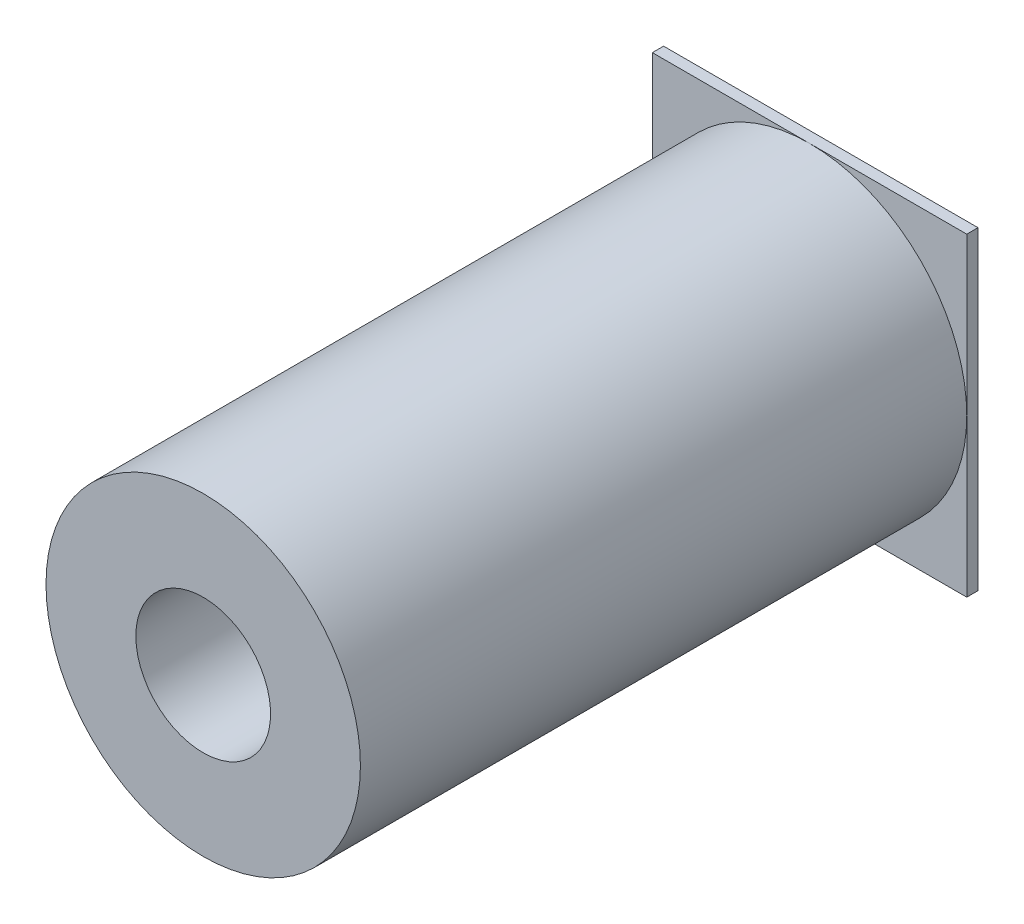
ISO-10303-21;
HEADER;
FILE_DESCRIPTION(('STEP AP214'),'2;1');
FILE_NAME('part.step','',(''),(''),'','','');
FILE_SCHEMA(('AUTOMOTIVE_DESIGN { 1 0 10303 214 1 1 1 1 }'));
ENDSEC;
DATA;
#1=APPLICATION_CONTEXT('core data for automotive mechanical design processes');
#2=APPLICATION_PROTOCOL_DEFINITION('international standard','automotive_design',2000,#1);
#3=PRODUCT_CONTEXT('',#1,'mechanical');
#4=PRODUCT('Part','Part','',(#3));
#5=PRODUCT_RELATED_PRODUCT_CATEGORY('part','',(#4));
#6=PRODUCT_DEFINITION_FORMATION('','',#4);
#7=PRODUCT_DEFINITION_CONTEXT('part definition',#1,'design');
#8=PRODUCT_DEFINITION('design','',#6,#7);
#9=PRODUCT_DEFINITION_SHAPE('','',#8);
#10=(LENGTH_UNIT() NAMED_UNIT(*) SI_UNIT(.MILLI.,.METRE.));
#11=(NAMED_UNIT(*) PLANE_ANGLE_UNIT() SI_UNIT($,.RADIAN.));
#12=(NAMED_UNIT(*) SI_UNIT($,.STERADIAN.) SOLID_ANGLE_UNIT());
#13=UNCERTAINTY_MEASURE_WITH_UNIT(LENGTH_MEASURE(1.E-05),#10,'distance_accuracy_value','');
#14=(GEOMETRIC_REPRESENTATION_CONTEXT(3) GLOBAL_UNCERTAINTY_ASSIGNED_CONTEXT((#13)) GLOBAL_UNIT_ASSIGNED_CONTEXT((#10,
#11,#12)) REPRESENTATION_CONTEXT('',''));
#15=CARTESIAN_POINT('',(0.,0.,0.));
#16=DIRECTION('',(0.,0.,1.));
#17=DIRECTION('',(1.,0.,0.));
#18=AXIS2_PLACEMENT_3D('',#15,#16,#17);
#19=CARTESIAN_POINT('',(0.,0.,1.));
#20=DIRECTION('',(0.,0.,1.));
#21=DIRECTION('',(1.,0.,0.));
#22=AXIS2_PLACEMENT_3D('',#19,#20,#21);
#23=PLANE('',#22);
#24=CARTESIAN_POINT('',(0.,0.,1.));
#25=DIRECTION('',(0.,0.,1.));
#26=DIRECTION('',(1.,0.,0.));
#27=AXIS2_PLACEMENT_3D('',#24,#25,#26);
#28=CIRCLE('',#27,14.);
#29=CARTESIAN_POINT('',(14.,0.,1.));
#30=VERTEX_POINT('',#29);
#31=CARTESIAN_POINT('',(0.,14.,1.));
#32=VERTEX_POINT('',#31);
#33=EDGE_CURVE('E48',#30,#32,#28,.T.);
#34=ORIENTED_EDGE('',*,*,#33,.F.);
#35=DIRECTION('',(0.,1.,0.));
#36=VECTOR('',#35,1.);
#37=CARTESIAN_POINT('',(14.,14.,1.));
#38=LINE('',#37,#36);
#39=CARTESIAN_POINT('',(14.,14.,1.));
#40=VERTEX_POINT('',#39);
#41=EDGE_CURVE('E99',#30,#40,#38,.T.);
#42=ORIENTED_EDGE('',*,*,#41,.T.);
#43=DIRECTION('',(-1.,0.,0.));
#44=VECTOR('',#43,1.);
#45=CARTESIAN_POINT('',(-14.,14.,1.));
#46=LINE('',#45,#44);
#47=EDGE_CURVE('E110',#40,#32,#46,.T.);
#48=ORIENTED_EDGE('',*,*,#47,.T.);
#49=EDGE_LOOP('',(#34,#42,#48));
#50=FACE_BOUND('',#49,.T.);
#51=ADVANCED_FACE('F37',(#50),#23,.T.);
#52=CARTESIAN_POINT('',(-14.,0.,1.));
#53=VERTEX_POINT('',#52);
#54=EDGE_CURVE('E11',#32,#53,#28,.T.);
#55=ORIENTED_EDGE('',*,*,#54,.F.);
#56=CARTESIAN_POINT('',(-14.,14.,1.));
#57=VERTEX_POINT('',#56);
#58=EDGE_CURVE('E98',#32,#57,#46,.T.);
#59=ORIENTED_EDGE('',*,*,#58,.T.);
#60=DIRECTION('',(0.,-1.,0.));
#61=VECTOR('',#60,1.);
#62=CARTESIAN_POINT('',(-14.,14.,1.));
#63=LINE('',#62,#61);
#64=EDGE_CURVE('E121',#57,#53,#63,.T.);
#65=ORIENTED_EDGE('',*,*,#64,.T.);
#66=EDGE_LOOP('',(#55,#59,#65));
#67=FACE_BOUND('',#66,.T.);
#68=ADVANCED_FACE('F154',(#67),#23,.T.);
#69=CARTESIAN_POINT('',(0.,-14.,1.));
#70=VERTEX_POINT('',#69);
#71=EDGE_CURVE('E46',#53,#70,#28,.T.);
#72=ORIENTED_EDGE('',*,*,#71,.F.);
#73=CARTESIAN_POINT('',(-14.,-14.,1.));
#74=VERTEX_POINT('',#73);
#75=EDGE_CURVE('E120',#53,#74,#63,.T.);
#76=ORIENTED_EDGE('',*,*,#75,.T.);
#77=DIRECTION('',(1.,0.,0.));
#78=VECTOR('',#77,1.);
#79=CARTESIAN_POINT('',(-14.,-14.,1.));
#80=LINE('',#79,#78);
#81=EDGE_CURVE('E124',#74,#70,#80,.T.);
#82=ORIENTED_EDGE('',*,*,#81,.T.);
#83=EDGE_LOOP('',(#72,#76,#82));
#84=FACE_BOUND('',#83,.T.);
#85=ADVANCED_FACE('F162',(#84),#23,.T.);
#86=CARTESIAN_POINT('',(14.,14.,1.));
#87=DIRECTION('',(-1.,0.,0.));
#88=DIRECTION('',(0.,-1.,0.));
#89=AXIS2_PLACEMENT_3D('',#86,#87,#88);
#90=PLANE('',#89);
#91=DIRECTION('',(0.,1.,0.));
#92=VECTOR('',#91,1.);
#93=CARTESIAN_POINT('',(14.,14.,0.));
#94=LINE('',#93,#92);
#95=CARTESIAN_POINT('',(14.,-14.,0.));
#96=VERTEX_POINT('',#95);
#97=CARTESIAN_POINT('',(14.,14.,0.));
#98=VERTEX_POINT('',#97);
#99=EDGE_CURVE('E127',#96,#98,#94,.T.);
#100=ORIENTED_EDGE('',*,*,#99,.T.);
#101=DIRECTION('',(0.,0.,-1.));
#102=VECTOR('',#101,1.);
#103=CARTESIAN_POINT('',(14.,14.,1.));
#104=LINE('',#103,#102);
#105=EDGE_CURVE('E41',#40,#98,#104,.T.);
#106=ORIENTED_EDGE('',*,*,#105,.F.);
#107=ORIENTED_EDGE('',*,*,#41,.F.);
#108=CARTESIAN_POINT('',(14.,-14.,1.));
#109=VERTEX_POINT('',#108);
#110=EDGE_CURVE('E91',#109,#30,#38,.T.);
#111=ORIENTED_EDGE('',*,*,#110,.F.);
#112=DIRECTION('',(0.,0.,-1.));
#113=VECTOR('',#112,1.);
#114=CARTESIAN_POINT('',(14.,-14.,1.));
#115=LINE('',#114,#113);
#116=EDGE_CURVE('E126',#109,#96,#115,.T.);
#117=ORIENTED_EDGE('',*,*,#116,.T.);
#118=EDGE_LOOP('',(#100,#106,#107,#111,#117));
#119=FACE_BOUND('',#118,.T.);
#120=ADVANCED_FACE('F39',(#119),#90,.F.);
#121=CARTESIAN_POINT('',(-14.,14.,1.));
#122=DIRECTION('',(0.,-1.,0.));
#123=DIRECTION('',(0.,0.,-1.));
#124=AXIS2_PLACEMENT_3D('',#121,#122,#123);
#125=PLANE('',#124);
#126=DIRECTION('',(-1.,0.,0.));
#127=VECTOR('',#126,1.);
#128=CARTESIAN_POINT('',(-14.,14.,0.));
#129=LINE('',#128,#127);
#130=CARTESIAN_POINT('',(-14.,14.,0.));
#131=VERTEX_POINT('',#130);
#132=EDGE_CURVE('E129',#98,#131,#129,.T.);
#133=ORIENTED_EDGE('',*,*,#132,.T.);
#134=DIRECTION('',(0.,0.,-1.));
#135=VECTOR('',#134,1.);
#136=CARTESIAN_POINT('',(-14.,14.,1.));
#137=LINE('',#136,#135);
#138=EDGE_CURVE('E115',#57,#131,#137,.T.);
#139=ORIENTED_EDGE('',*,*,#138,.F.);
#140=ORIENTED_EDGE('',*,*,#58,.F.);
#141=ORIENTED_EDGE('',*,*,#47,.F.);
#142=ORIENTED_EDGE('',*,*,#105,.T.);
#143=EDGE_LOOP('',(#133,#139,#140,#141,#142));
#144=FACE_BOUND('',#143,.T.);
#145=ADVANCED_FACE('F155',(#144),#125,.F.);
#146=CARTESIAN_POINT('',(-14.,14.,1.));
#147=DIRECTION('',(1.,0.,0.));
#148=DIRECTION('',(0.,1.,0.));
#149=AXIS2_PLACEMENT_3D('',#146,#147,#148);
#150=PLANE('',#149);
#151=DIRECTION('',(0.,-1.,0.));
#152=VECTOR('',#151,1.);
#153=CARTESIAN_POINT('',(-14.,14.,0.));
#154=LINE('',#153,#152);
#155=CARTESIAN_POINT('',(-14.,-14.,0.));
#156=VERTEX_POINT('',#155);
#157=EDGE_CURVE('E131',#131,#156,#154,.T.);
#158=ORIENTED_EDGE('',*,*,#157,.T.);
#159=DIRECTION('',(0.,0.,-1.));
#160=VECTOR('',#159,1.);
#161=CARTESIAN_POINT('',(-14.,-14.,1.));
#162=LINE('',#161,#160);
#163=EDGE_CURVE('E135',#74,#156,#162,.T.);
#164=ORIENTED_EDGE('',*,*,#163,.F.);
#165=ORIENTED_EDGE('',*,*,#75,.F.);
#166=ORIENTED_EDGE('',*,*,#64,.F.);
#167=ORIENTED_EDGE('',*,*,#138,.T.);
#168=EDGE_LOOP('',(#158,#164,#165,#166,#167));
#169=FACE_BOUND('',#168,.T.);
#170=ADVANCED_FACE('F142',(#169),#150,.F.);
#171=CARTESIAN_POINT('',(-14.,-14.,1.));
#172=DIRECTION('',(0.,1.,0.));
#173=DIRECTION('',(0.,0.,1.));
#174=AXIS2_PLACEMENT_3D('',#171,#172,#173);
#175=PLANE('',#174);
#176=DIRECTION('',(1.,0.,0.));
#177=VECTOR('',#176,1.);
#178=CARTESIAN_POINT('',(-14.,-14.,0.));
#179=LINE('',#178,#177);
#180=EDGE_CURVE('E108',#156,#96,#179,.T.);
#181=ORIENTED_EDGE('',*,*,#180,.T.);
#182=ORIENTED_EDGE('',*,*,#116,.F.);
#183=EDGE_CURVE('E94',#70,#109,#80,.T.);
#184=ORIENTED_EDGE('',*,*,#183,.F.);
#185=ORIENTED_EDGE('',*,*,#81,.F.);
#186=ORIENTED_EDGE('',*,*,#163,.T.);
#187=EDGE_LOOP('',(#181,#182,#184,#185,#186));
#188=FACE_BOUND('',#187,.T.);
#189=ADVANCED_FACE('F151',(#188),#175,.F.);
#190=EDGE_CURVE('E55',#70,#30,#28,.T.);
#191=ORIENTED_EDGE('',*,*,#190,.F.);
#192=ORIENTED_EDGE('',*,*,#183,.T.);
#193=ORIENTED_EDGE('',*,*,#110,.T.);
#194=EDGE_LOOP('',(#191,#192,#193));
#195=FACE_BOUND('',#194,.T.);
#196=ADVANCED_FACE('F93',(#195),#23,.T.);
#197=CARTESIAN_POINT('',(0.,0.,0.));
#198=DIRECTION('',(0.,0.,1.));
#199=DIRECTION('',(1.,0.,0.));
#200=AXIS2_PLACEMENT_3D('',#197,#198,#199);
#201=PLANE('',#200);
#202=CARTESIAN_POINT('',(0.,0.,0.));
#203=DIRECTION('',(0.,0.,-1.));
#204=DIRECTION('',(-1.,0.,0.));
#205=AXIS2_PLACEMENT_3D('',#202,#203,#204);
#206=CIRCLE('',#205,6.);
#207=CARTESIAN_POINT('',(-6.,0.,0.));
#208=VERTEX_POINT('',#207);
#209=EDGE_CURVE('E283',#208,#208,#206,.T.);
#210=ORIENTED_EDGE('',*,*,#209,.F.);
#211=EDGE_LOOP('',(#210));
#212=FACE_BOUND('',#211,.T.);
#213=ORIENTED_EDGE('',*,*,#99,.F.);
#214=ORIENTED_EDGE('',*,*,#180,.F.);
#215=ORIENTED_EDGE('',*,*,#157,.F.);
#216=ORIENTED_EDGE('',*,*,#132,.F.);
#217=EDGE_LOOP('',(#213,#214,#215,#216));
#218=FACE_BOUND('',#217,.T.);
#219=ADVANCED_FACE('F149',(#212,#218),#201,.F.);
#220=CARTESIAN_POINT('',(0.,0.,55.));
#221=DIRECTION('',(0.,0.,-1.));
#222=DIRECTION('',(-1.,0.,0.));
#223=AXIS2_PLACEMENT_3D('',#220,#221,#222);
#224=CYLINDRICAL_SURFACE('',#223,14.);
#225=CARTESIAN_POINT('',(0.,0.,55.));
#226=DIRECTION('',(0.,0.,1.));
#227=DIRECTION('',(1.,0.,0.));
#228=AXIS2_PLACEMENT_3D('',#225,#226,#227);
#229=CIRCLE('',#228,14.);
#230=CARTESIAN_POINT('',(14.,0.,55.));
#231=VERTEX_POINT('',#230);
#232=EDGE_CURVE('E112',#231,#231,#229,.T.);
#233=ORIENTED_EDGE('',*,*,#232,.F.);
#234=EDGE_LOOP('',(#233));
#235=FACE_BOUND('',#234,.T.);
#236=ORIENTED_EDGE('',*,*,#33,.T.);
#237=ORIENTED_EDGE('',*,*,#54,.T.);
#238=ORIENTED_EDGE('',*,*,#71,.T.);
#239=ORIENTED_EDGE('',*,*,#190,.T.);
#240=EDGE_LOOP('',(#236,#237,#238,#239));
#241=FACE_BOUND('',#240,.T.);
#242=ADVANCED_FACE('F114',(#235,#241),#224,.T.);
#243=CARTESIAN_POINT('',(0.,0.,55.));
#244=DIRECTION('',(0.,0.,1.));
#245=DIRECTION('',(1.,0.,0.));
#246=AXIS2_PLACEMENT_3D('',#243,#244,#245);
#247=PLANE('',#246);
#248=CARTESIAN_POINT('',(0.,0.,55.));
#249=DIRECTION('',(0.,0.,-1.));
#250=DIRECTION('',(-1.,0.,0.));
#251=AXIS2_PLACEMENT_3D('',#248,#249,#250);
#252=CIRCLE('',#251,6.);
#253=CARTESIAN_POINT('',(-6.,0.,55.));
#254=VERTEX_POINT('',#253);
#255=EDGE_CURVE('E113',#254,#254,#252,.T.);
#256=ORIENTED_EDGE('',*,*,#255,.T.);
#257=EDGE_LOOP('',(#256));
#258=FACE_BOUND('',#257,.T.);
#259=ORIENTED_EDGE('',*,*,#232,.T.);
#260=EDGE_LOOP('',(#259));
#261=FACE_BOUND('',#260,.T.);
#262=ADVANCED_FACE('F221',(#258,#261),#247,.T.);
#263=CARTESIAN_POINT('',(0.,0.,55.));
#264=DIRECTION('',(0.,0.,-1.));
#265=DIRECTION('',(-1.,0.,0.));
#266=AXIS2_PLACEMENT_3D('',#263,#264,#265);
#267=CYLINDRICAL_SURFACE('',#266,6.);
#268=ORIENTED_EDGE('',*,*,#255,.F.);
#269=EDGE_LOOP('',(#268));
#270=FACE_BOUND('',#269,.T.);
#271=ORIENTED_EDGE('',*,*,#209,.T.);
#272=EDGE_LOOP('',(#271));
#273=FACE_BOUND('',#272,.T.);
#274=ADVANCED_FACE('F239',(#270,#273),#267,.F.);
#275=CLOSED_SHELL('',(#51,#68,#85,#120,#145,#170,#189,#196,#219,#242,#262,#274));
#276=MANIFOLD_SOLID_BREP('B2',#275);
#277=ADVANCED_BREP_SHAPE_REPRESENTATION('',(#18,#276),#14);
#278=SHAPE_DEFINITION_REPRESENTATION(#9,#277);
ENDSEC;
END-ISO-10303-21;
